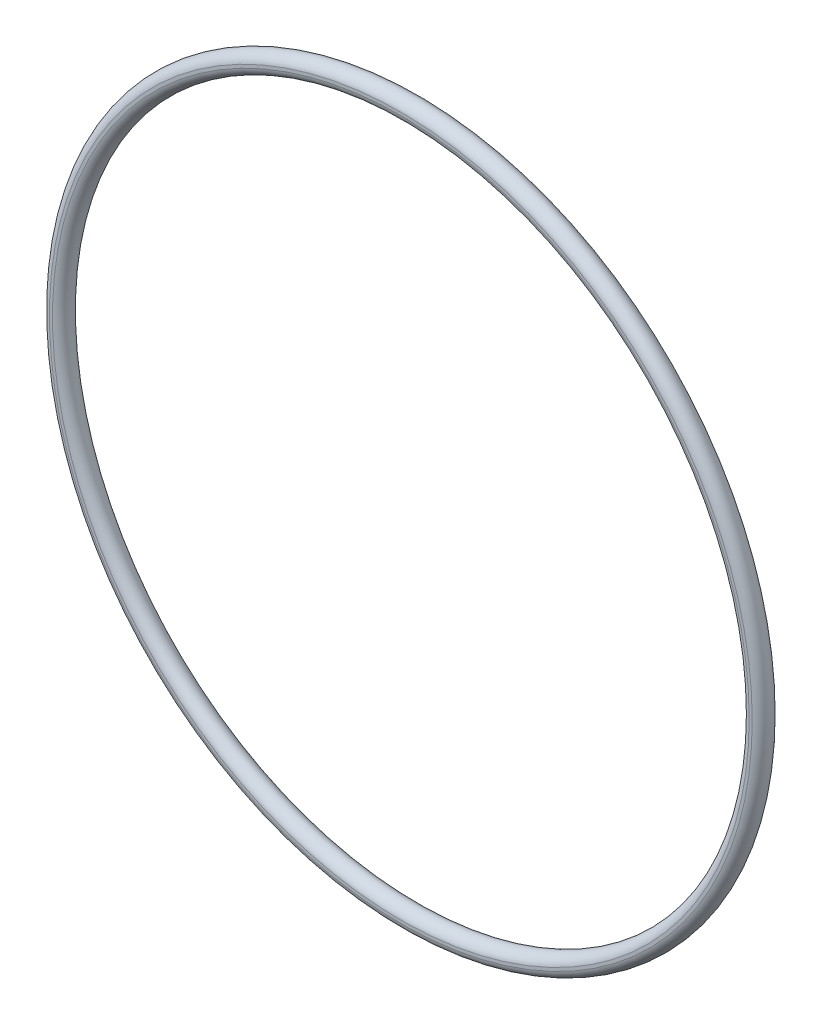
ISO-10303-21;
HEADER;
FILE_DESCRIPTION(('STEP AP214'),'2;1');
FILE_NAME('part.step','',(''),(''),'','','');
FILE_SCHEMA(('AUTOMOTIVE_DESIGN { 1 0 10303 214 1 1 1 1 }'));
ENDSEC;
DATA;
#1=APPLICATION_CONTEXT('core data for automotive mechanical design processes');
#2=APPLICATION_PROTOCOL_DEFINITION('international standard','automotive_design',2000,#1);
#3=PRODUCT_CONTEXT('',#1,'mechanical');
#4=PRODUCT('Part','Part','',(#3));
#5=PRODUCT_RELATED_PRODUCT_CATEGORY('part','',(#4));
#6=PRODUCT_DEFINITION_FORMATION('','',#4);
#7=PRODUCT_DEFINITION_CONTEXT('part definition',#1,'design');
#8=PRODUCT_DEFINITION('design','',#6,#7);
#9=PRODUCT_DEFINITION_SHAPE('','',#8);
#10=(LENGTH_UNIT() NAMED_UNIT(*) SI_UNIT(.MILLI.,.METRE.));
#11=(NAMED_UNIT(*) PLANE_ANGLE_UNIT() SI_UNIT($,.RADIAN.));
#12=(NAMED_UNIT(*) SI_UNIT($,.STERADIAN.) SOLID_ANGLE_UNIT());
#13=UNCERTAINTY_MEASURE_WITH_UNIT(LENGTH_MEASURE(1.E-05),#10,'distance_accuracy_value','');
#14=(GEOMETRIC_REPRESENTATION_CONTEXT(3) GLOBAL_UNCERTAINTY_ASSIGNED_CONTEXT((#13)) GLOBAL_UNIT_ASSIGNED_CONTEXT((#10,
#11,#12)) REPRESENTATION_CONTEXT('',''));
#15=CARTESIAN_POINT('',(0.,0.,0.));
#16=DIRECTION('',(0.,0.,1.));
#17=DIRECTION('',(1.,0.,0.));
#18=AXIS2_PLACEMENT_3D('',#15,#16,#17);
#19=CARTESIAN_POINT('',(0.,0.,0.));
#20=DIRECTION('',(0.,0.,1.));
#21=DIRECTION('',(1.,0.,0.));
#22=AXIS2_PLACEMENT_3D('',#19,#20,#21);
#23=TOROIDAL_SURFACE('',#22,91.7067,2.667);
#24=CARTESIAN_POINT('',(0.,0.,2.63650827382196));
#25=DIRECTION('',(0.,0.,1.));
#26=DIRECTION('',(1.,0.,0.));
#27=AXIS2_PLACEMENT_3D('',#24,#25,#26);
#28=CIRCLE('',#27,91.3045642989384);
#29=CARTESIAN_POINT('',(91.3045642989384,0.,2.63650827382196));
#30=VERTEX_POINT('',#29);
#31=EDGE_CURVE('E10',#30,#30,#28,.T.);
#32=ORIENTED_EDGE('',*,*,#31,.T.);
#33=EDGE_LOOP('',(#32));
#34=FACE_BOUND('',#33,.T.);
#35=CARTESIAN_POINT('',(0.,0.,-2.63650827382197));
#36=DIRECTION('',(0.,0.,1.));
#37=DIRECTION('',(1.,0.,0.));
#38=AXIS2_PLACEMENT_3D('',#35,#36,#37);
#39=CIRCLE('',#38,91.3045642989384);
#40=CARTESIAN_POINT('',(91.3045642989384,0.,-2.63650827382197));
#41=VERTEX_POINT('',#40);
#42=EDGE_CURVE('E58',#41,#41,#39,.T.);
#43=ORIENTED_EDGE('',*,*,#42,.F.);
#44=EDGE_LOOP('',(#43));
#45=FACE_BOUND('',#44,.T.);
#46=ADVANCED_FACE('F41',(#34,#45),#23,.T.);
#47=CARTESIAN_POINT('',(0.,0.,2.63650827382196));
#48=DIRECTION('',(0.,0.,1.));
#49=DIRECTION('',(1.,0.,0.));
#50=AXIS2_PLACEMENT_3D('',#47,#48,#49);
#51=PLANE('',#50);
#52=CARTESIAN_POINT('',(0.,0.,2.63650827382196));
#53=DIRECTION('',(0.,0.,1.));
#54=DIRECTION('',(1.,0.,0.));
#55=AXIS2_PLACEMENT_3D('',#52,#53,#54);
#56=CIRCLE('',#55,92.1088357010616);
#57=CARTESIAN_POINT('',(92.1088357010616,0.,2.63650827382196));
#58=VERTEX_POINT('',#57);
#59=EDGE_CURVE('E48',#58,#58,#56,.T.);
#60=ORIENTED_EDGE('',*,*,#59,.T.);
#61=EDGE_LOOP('',(#60));
#62=FACE_BOUND('',#61,.T.);
#63=ORIENTED_EDGE('',*,*,#31,.F.);
#64=EDGE_LOOP('',(#63));
#65=FACE_BOUND('',#64,.T.);
#66=ADVANCED_FACE('F68',(#62,#65),#51,.T.);
#67=CARTESIAN_POINT('',(0.,0.,0.));
#68=DIRECTION('',(0.,0.,1.));
#69=DIRECTION('',(1.,0.,0.));
#70=AXIS2_PLACEMENT_3D('',#67,#68,#69);
#71=TOROIDAL_SURFACE('',#70,91.7067,2.667);
#72=CARTESIAN_POINT('',(0.,0.,-2.63650827382197));
#73=DIRECTION('',(0.,0.,1.));
#74=DIRECTION('',(1.,0.,0.));
#75=AXIS2_PLACEMENT_3D('',#72,#73,#74);
#76=CIRCLE('',#75,92.1088357010616);
#77=CARTESIAN_POINT('',(92.1088357010616,0.,-2.63650827382197));
#78=VERTEX_POINT('',#77);
#79=EDGE_CURVE('E53',#78,#78,#76,.T.);
#80=ORIENTED_EDGE('',*,*,#79,.T.);
#81=EDGE_LOOP('',(#80));
#82=FACE_BOUND('',#81,.T.);
#83=ORIENTED_EDGE('',*,*,#59,.F.);
#84=EDGE_LOOP('',(#83));
#85=FACE_BOUND('',#84,.T.);
#86=ADVANCED_FACE('F72',(#82,#85),#71,.T.);
#87=CARTESIAN_POINT('',(0.,0.,-2.63650827382197));
#88=DIRECTION('',(0.,0.,1.));
#89=DIRECTION('',(1.,0.,0.));
#90=AXIS2_PLACEMENT_3D('',#87,#88,#89);
#91=PLANE('',#90);
#92=ORIENTED_EDGE('',*,*,#79,.F.);
#93=EDGE_LOOP('',(#92));
#94=FACE_BOUND('',#93,.T.);
#95=ORIENTED_EDGE('',*,*,#42,.T.);
#96=EDGE_LOOP('',(#95));
#97=FACE_BOUND('',#96,.T.);
#98=ADVANCED_FACE('F65',(#94,#97),#91,.F.);
#99=CLOSED_SHELL('',(#46,#66,#86,#98));
#100=MANIFOLD_SOLID_BREP('B2',#99);
#101=ADVANCED_BREP_SHAPE_REPRESENTATION('',(#18,#100),#14);
#102=SHAPE_DEFINITION_REPRESENTATION(#9,#101);
ENDSEC;
END-ISO-10303-21;
